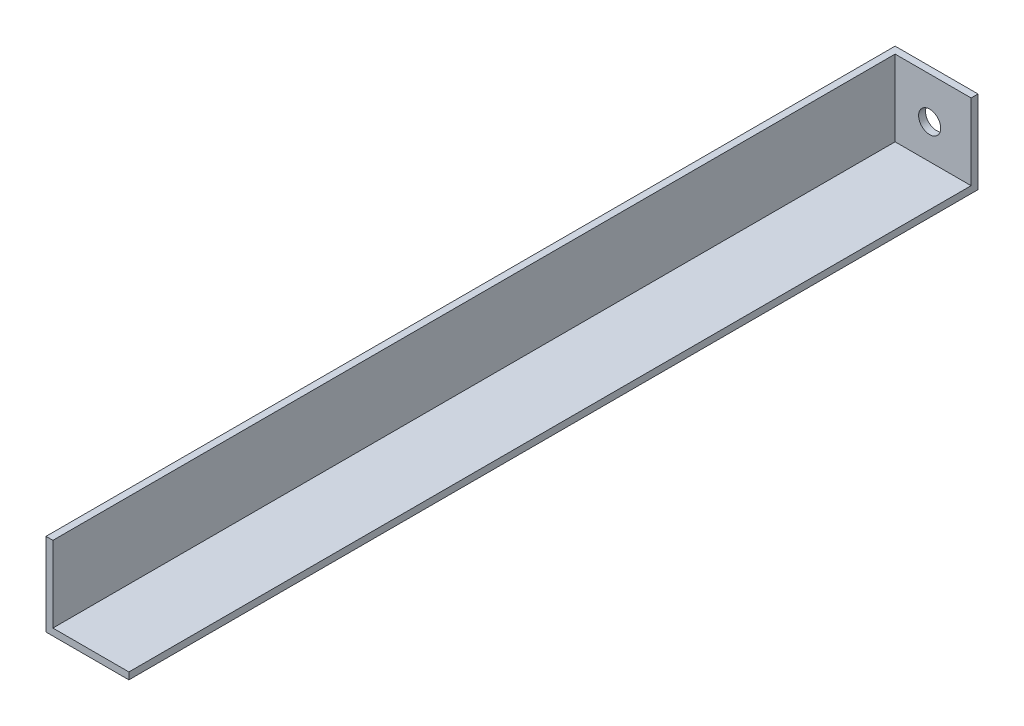
ISO-10303-21;
HEADER;
FILE_DESCRIPTION(('STEP AP214'),'2;1');
FILE_NAME('part.step','',(''),(''),'','','');
FILE_SCHEMA(('AUTOMOTIVE_DESIGN { 1 0 10303 214 1 1 1 1 }'));
ENDSEC;
DATA;
#1=APPLICATION_CONTEXT('core data for automotive mechanical design processes');
#2=APPLICATION_PROTOCOL_DEFINITION('international standard','automotive_design',2000,#1);
#3=PRODUCT_CONTEXT('',#1,'mechanical');
#4=PRODUCT('Part','Part','',(#3));
#5=PRODUCT_RELATED_PRODUCT_CATEGORY('part','',(#4));
#6=PRODUCT_DEFINITION_FORMATION('','',#4);
#7=PRODUCT_DEFINITION_CONTEXT('part definition',#1,'design');
#8=PRODUCT_DEFINITION('design','',#6,#7);
#9=PRODUCT_DEFINITION_SHAPE('','',#8);
#10=(LENGTH_UNIT() NAMED_UNIT(*) SI_UNIT(.MILLI.,.METRE.));
#11=(NAMED_UNIT(*) PLANE_ANGLE_UNIT() SI_UNIT($,.RADIAN.));
#12=(NAMED_UNIT(*) SI_UNIT($,.STERADIAN.) SOLID_ANGLE_UNIT());
#13=UNCERTAINTY_MEASURE_WITH_UNIT(LENGTH_MEASURE(1.E-05),#10,'distance_accuracy_value','');
#14=(GEOMETRIC_REPRESENTATION_CONTEXT(3) GLOBAL_UNCERTAINTY_ASSIGNED_CONTEXT((#13)) GLOBAL_UNIT_ASSIGNED_CONTEXT((#10,
#11,#12)) REPRESENTATION_CONTEXT('',''));
#15=CARTESIAN_POINT('',(0.,0.,0.));
#16=DIRECTION('',(0.,0.,1.));
#17=DIRECTION('',(1.,0.,0.));
#18=AXIS2_PLACEMENT_3D('',#15,#16,#17);
#19=CARTESIAN_POINT('',(30.,0.,304.8));
#20=DIRECTION('',(0.,1.,0.));
#21=DIRECTION('',(-1.,0.,0.));
#22=AXIS2_PLACEMENT_3D('',#19,#20,#21);
#23=PLANE('',#22);
#24=DIRECTION('',(0.,0.,-1.));
#25=VECTOR('',#24,1.);
#26=CARTESIAN_POINT('',(0.,0.,304.8));
#27=LINE('',#26,#25);
#28=CARTESIAN_POINT('',(0.,0.,304.8));
#29=VERTEX_POINT('',#28);
#30=CARTESIAN_POINT('',(0.,0.,-2.5));
#31=VERTEX_POINT('',#30);
#32=EDGE_CURVE('E95',#29,#31,#27,.T.);
#33=ORIENTED_EDGE('',*,*,#32,.T.);
#34=DIRECTION('',(-1.,0.,0.));
#35=VECTOR('',#34,1.);
#36=CARTESIAN_POINT('',(0.,0.,-2.5));
#37=LINE('',#36,#35);
#38=CARTESIAN_POINT('',(30.,0.,-2.5));
#39=VERTEX_POINT('',#38);
#40=EDGE_CURVE('E111',#39,#31,#37,.T.);
#41=ORIENTED_EDGE('',*,*,#40,.F.);
#42=DIRECTION('',(0.,0.,-1.));
#43=VECTOR('',#42,1.);
#44=CARTESIAN_POINT('',(30.,0.,304.8));
#45=LINE('',#44,#43);
#46=CARTESIAN_POINT('',(30.,0.,304.8));
#47=VERTEX_POINT('',#46);
#48=EDGE_CURVE('E11',#47,#39,#45,.T.);
#49=ORIENTED_EDGE('',*,*,#48,.F.);
#50=DIRECTION('',(1.,0.,0.));
#51=VECTOR('',#50,1.);
#52=CARTESIAN_POINT('',(30.,0.,304.8));
#53=LINE('',#52,#51);
#54=EDGE_CURVE('E128',#29,#47,#53,.T.);
#55=ORIENTED_EDGE('',*,*,#54,.F.);
#56=EDGE_LOOP('',(#33,#41,#49,#55));
#57=FACE_BOUND('',#56,.T.);
#58=ADVANCED_FACE('F32',(#57),#23,.F.);
#59=CARTESIAN_POINT('',(30.,2.5,304.8));
#60=DIRECTION('',(-1.,0.,0.));
#61=DIRECTION('',(0.,0.,1.));
#62=AXIS2_PLACEMENT_3D('',#59,#60,#61);
#63=PLANE('',#62);
#64=ORIENTED_EDGE('',*,*,#48,.T.);
#65=DIRECTION('',(0.,-1.,0.));
#66=VECTOR('',#65,1.);
#67=CARTESIAN_POINT('',(30.,0.,-2.5));
#68=LINE('',#67,#66);
#69=CARTESIAN_POINT('',(30.,30.,-2.5));
#70=VERTEX_POINT('',#69);
#71=EDGE_CURVE('E106',#70,#39,#68,.T.);
#72=ORIENTED_EDGE('',*,*,#71,.F.);
#73=DIRECTION('',(0.,0.,1.));
#74=VECTOR('',#73,1.);
#75=CARTESIAN_POINT('',(30.,30.,-2.5));
#76=LINE('',#75,#74);
#77=CARTESIAN_POINT('',(30.,30.,0.));
#78=VERTEX_POINT('',#77);
#79=EDGE_CURVE('E102',#70,#78,#76,.T.);
#80=ORIENTED_EDGE('',*,*,#79,.T.);
#81=DIRECTION('',(0.,-1.,0.));
#82=VECTOR('',#81,1.);
#83=CARTESIAN_POINT('',(30.,0.,0.));
#84=LINE('',#83,#82);
#85=CARTESIAN_POINT('',(30.,2.5,0.));
#86=VERTEX_POINT('',#85);
#87=EDGE_CURVE('E112',#78,#86,#84,.T.);
#88=ORIENTED_EDGE('',*,*,#87,.T.);
#89=DIRECTION('',(0.,0.,-1.));
#90=VECTOR('',#89,1.);
#91=CARTESIAN_POINT('',(30.,2.5,304.8));
#92=LINE('',#91,#90);
#93=CARTESIAN_POINT('',(30.,2.5,304.8));
#94=VERTEX_POINT('',#93);
#95=EDGE_CURVE('E41',#94,#86,#92,.T.);
#96=ORIENTED_EDGE('',*,*,#95,.F.);
#97=DIRECTION('',(0.,1.,0.));
#98=VECTOR('',#97,1.);
#99=CARTESIAN_POINT('',(30.,2.5,304.8));
#100=LINE('',#99,#98);
#101=EDGE_CURVE('E130',#47,#94,#100,.T.);
#102=ORIENTED_EDGE('',*,*,#101,.F.);
#103=EDGE_LOOP('',(#64,#72,#80,#88,#96,#102));
#104=FACE_BOUND('',#103,.T.);
#105=ADVANCED_FACE('F165',(#104),#63,.F.);
#106=CARTESIAN_POINT('',(2.5,2.5,304.8));
#107=DIRECTION('',(0.,-1.,0.));
#108=DIRECTION('',(1.,0.,0.));
#109=AXIS2_PLACEMENT_3D('',#106,#107,#108);
#110=PLANE('',#109);
#111=DIRECTION('',(-1.,0.,0.));
#112=VECTOR('',#111,1.);
#113=CARTESIAN_POINT('',(2.5,2.5,0.));
#114=LINE('',#113,#112);
#115=CARTESIAN_POINT('',(2.5,2.5,0.));
#116=VERTEX_POINT('',#115);
#117=EDGE_CURVE('E146',#86,#116,#114,.T.);
#118=ORIENTED_EDGE('',*,*,#117,.T.);
#119=DIRECTION('',(0.,0.,-1.));
#120=VECTOR('',#119,1.);
#121=CARTESIAN_POINT('',(2.5,2.5,304.8));
#122=LINE('',#121,#120);
#123=CARTESIAN_POINT('',(2.5,2.5,304.8));
#124=VERTEX_POINT('',#123);
#125=EDGE_CURVE('E149',#124,#116,#122,.T.);
#126=ORIENTED_EDGE('',*,*,#125,.F.);
#127=DIRECTION('',(-1.,0.,0.));
#128=VECTOR('',#127,1.);
#129=CARTESIAN_POINT('',(2.5,2.5,304.8));
#130=LINE('',#129,#128);
#131=EDGE_CURVE('E133',#94,#124,#130,.T.);
#132=ORIENTED_EDGE('',*,*,#131,.F.);
#133=ORIENTED_EDGE('',*,*,#95,.T.);
#134=EDGE_LOOP('',(#118,#126,#132,#133));
#135=FACE_BOUND('',#134,.T.);
#136=ADVANCED_FACE('F173',(#135),#110,.F.);
#137=CARTESIAN_POINT('',(2.5,30.,304.8));
#138=DIRECTION('',(-1.,0.,0.));
#139=DIRECTION('',(0.,-1.,0.));
#140=AXIS2_PLACEMENT_3D('',#137,#138,#139);
#141=PLANE('',#140);
#142=DIRECTION('',(0.,1.,0.));
#143=VECTOR('',#142,1.);
#144=CARTESIAN_POINT('',(2.5,30.,0.));
#145=LINE('',#144,#143);
#146=CARTESIAN_POINT('',(2.5,30.,0.));
#147=VERTEX_POINT('',#146);
#148=EDGE_CURVE('E131',#116,#147,#145,.T.);
#149=ORIENTED_EDGE('',*,*,#148,.T.);
#150=DIRECTION('',(0.,0.,-1.));
#151=VECTOR('',#150,1.);
#152=CARTESIAN_POINT('',(2.5,30.,304.8));
#153=LINE('',#152,#151);
#154=CARTESIAN_POINT('',(2.5,30.,304.8));
#155=VERTEX_POINT('',#154);
#156=EDGE_CURVE('E94',#155,#147,#153,.T.);
#157=ORIENTED_EDGE('',*,*,#156,.F.);
#158=DIRECTION('',(0.,1.,0.));
#159=VECTOR('',#158,1.);
#160=CARTESIAN_POINT('',(2.5,30.,304.8));
#161=LINE('',#160,#159);
#162=EDGE_CURVE('E135',#124,#155,#161,.T.);
#163=ORIENTED_EDGE('',*,*,#162,.F.);
#164=ORIENTED_EDGE('',*,*,#125,.T.);
#165=EDGE_LOOP('',(#149,#157,#163,#164));
#166=FACE_BOUND('',#165,.T.);
#167=ADVANCED_FACE('F170',(#166),#141,.F.);
#168=CARTESIAN_POINT('',(0.,30.,304.8));
#169=DIRECTION('',(0.,-1.,0.));
#170=DIRECTION('',(0.,0.,-1.));
#171=AXIS2_PLACEMENT_3D('',#168,#169,#170);
#172=PLANE('',#171);
#173=ORIENTED_EDGE('',*,*,#156,.T.);
#174=DIRECTION('',(1.,0.,0.));
#175=VECTOR('',#174,1.);
#176=CARTESIAN_POINT('',(0.,30.,0.));
#177=LINE('',#176,#175);
#178=EDGE_CURVE('E115',#147,#78,#177,.T.);
#179=ORIENTED_EDGE('',*,*,#178,.T.);
#180=ORIENTED_EDGE('',*,*,#79,.F.);
#181=DIRECTION('',(1.,0.,0.));
#182=VECTOR('',#181,1.);
#183=CARTESIAN_POINT('',(0.,30.,-2.5));
#184=LINE('',#183,#182);
#185=CARTESIAN_POINT('',(0.,30.,-2.5));
#186=VERTEX_POINT('',#185);
#187=EDGE_CURVE('E98',#186,#70,#184,.T.);
#188=ORIENTED_EDGE('',*,*,#187,.F.);
#189=DIRECTION('',(0.,0.,-1.));
#190=VECTOR('',#189,1.);
#191=CARTESIAN_POINT('',(0.,30.,304.8));
#192=LINE('',#191,#190);
#193=CARTESIAN_POINT('',(0.,30.,304.8));
#194=VERTEX_POINT('',#193);
#195=EDGE_CURVE('E87',#194,#186,#192,.T.);
#196=ORIENTED_EDGE('',*,*,#195,.F.);
#197=DIRECTION('',(-1.,0.,0.));
#198=VECTOR('',#197,1.);
#199=CARTESIAN_POINT('',(0.,30.,304.8));
#200=LINE('',#199,#198);
#201=EDGE_CURVE('E137',#155,#194,#200,.T.);
#202=ORIENTED_EDGE('',*,*,#201,.F.);
#203=EDGE_LOOP('',(#173,#179,#180,#188,#196,#202));
#204=FACE_BOUND('',#203,.T.);
#205=ADVANCED_FACE('F100',(#204),#172,.F.);
#206=CARTESIAN_POINT('',(0.,0.,304.8));
#207=DIRECTION('',(1.,0.,0.));
#208=DIRECTION('',(0.,0.,-1.));
#209=AXIS2_PLACEMENT_3D('',#206,#207,#208);
#210=PLANE('',#209);
#211=ORIENTED_EDGE('',*,*,#195,.T.);
#212=DIRECTION('',(0.,1.,0.));
#213=VECTOR('',#212,1.);
#214=CARTESIAN_POINT('',(0.,0.,-2.5));
#215=LINE('',#214,#213);
#216=EDGE_CURVE('E91',#31,#186,#215,.T.);
#217=ORIENTED_EDGE('',*,*,#216,.F.);
#218=ORIENTED_EDGE('',*,*,#32,.F.);
#219=DIRECTION('',(0.,-1.,0.));
#220=VECTOR('',#219,1.);
#221=CARTESIAN_POINT('',(0.,0.,304.8));
#222=LINE('',#221,#220);
#223=EDGE_CURVE('E49',#194,#29,#222,.T.);
#224=ORIENTED_EDGE('',*,*,#223,.F.);
#225=EDGE_LOOP('',(#211,#217,#218,#224));
#226=FACE_BOUND('',#225,.T.);
#227=ADVANCED_FACE('F89',(#226),#210,.F.);
#228=CARTESIAN_POINT('',(0.,0.,304.8));
#229=DIRECTION('',(0.,0.,-1.));
#230=DIRECTION('',(-1.,0.,0.));
#231=AXIS2_PLACEMENT_3D('',#228,#229,#230);
#232=PLANE('',#231);
#233=ORIENTED_EDGE('',*,*,#54,.T.);
#234=ORIENTED_EDGE('',*,*,#101,.T.);
#235=ORIENTED_EDGE('',*,*,#131,.T.);
#236=ORIENTED_EDGE('',*,*,#162,.T.);
#237=ORIENTED_EDGE('',*,*,#201,.T.);
#238=ORIENTED_EDGE('',*,*,#223,.T.);
#239=EDGE_LOOP('',(#233,#234,#235,#236,#237,#238));
#240=FACE_BOUND('',#239,.T.);
#241=ADVANCED_FACE('F171',(#240),#232,.F.);
#242=CARTESIAN_POINT('',(0.,0.,-2.5));
#243=DIRECTION('',(0.,0.,-1.));
#244=DIRECTION('',(-1.,0.,0.));
#245=AXIS2_PLACEMENT_3D('',#242,#243,#244);
#246=PLANE('',#245);
#247=CARTESIAN_POINT('',(15.,15.,-2.5));
#248=DIRECTION('',(0.,0.,-1.));
#249=DIRECTION('',(-1.,0.,0.));
#250=AXIS2_PLACEMENT_3D('',#247,#248,#249);
#251=CIRCLE('',#250,4.);
#252=CARTESIAN_POINT('',(11.,15.,-2.5));
#253=VERTEX_POINT('',#252);
#254=EDGE_CURVE('E118',#253,#253,#251,.T.);
#255=ORIENTED_EDGE('',*,*,#254,.F.);
#256=EDGE_LOOP('',(#255));
#257=FACE_BOUND('',#256,.T.);
#258=ORIENTED_EDGE('',*,*,#216,.T.);
#259=ORIENTED_EDGE('',*,*,#187,.T.);
#260=ORIENTED_EDGE('',*,*,#71,.T.);
#261=ORIENTED_EDGE('',*,*,#40,.T.);
#262=EDGE_LOOP('',(#258,#259,#260,#261));
#263=FACE_BOUND('',#262,.T.);
#264=ADVANCED_FACE('F109',(#257,#263),#246,.T.);
#265=CARTESIAN_POINT('',(0.,0.,0.));
#266=DIRECTION('',(0.,0.,-1.));
#267=DIRECTION('',(-1.,0.,0.));
#268=AXIS2_PLACEMENT_3D('',#265,#266,#267);
#269=PLANE('',#268);
#270=CARTESIAN_POINT('',(15.,15.,0.));
#271=DIRECTION('',(0.,0.,-1.));
#272=DIRECTION('',(-1.,0.,0.));
#273=AXIS2_PLACEMENT_3D('',#270,#271,#272);
#274=CIRCLE('',#273,4.);
#275=CARTESIAN_POINT('',(11.,15.,0.));
#276=VERTEX_POINT('',#275);
#277=EDGE_CURVE('E35',#276,#276,#274,.T.);
#278=ORIENTED_EDGE('',*,*,#277,.T.);
#279=EDGE_LOOP('',(#278));
#280=FACE_BOUND('',#279,.T.);
#281=ORIENTED_EDGE('',*,*,#148,.F.);
#282=ORIENTED_EDGE('',*,*,#117,.F.);
#283=ORIENTED_EDGE('',*,*,#87,.F.);
#284=ORIENTED_EDGE('',*,*,#178,.F.);
#285=EDGE_LOOP('',(#281,#282,#283,#284));
#286=FACE_BOUND('',#285,.T.);
#287=ADVANCED_FACE('F169',(#280,#286),#269,.F.);
#288=CARTESIAN_POINT('',(15.,15.,304.800025));
#289=DIRECTION('',(0.,0.,-1.));
#290=DIRECTION('',(-1.,0.,0.));
#291=AXIS2_PLACEMENT_3D('',#288,#289,#290);
#292=CYLINDRICAL_SURFACE('',#291,4.);
#293=ORIENTED_EDGE('',*,*,#254,.T.);
#294=EDGE_LOOP('',(#293));
#295=FACE_BOUND('',#294,.T.);
#296=ORIENTED_EDGE('',*,*,#277,.F.);
#297=EDGE_LOOP('',(#296));
#298=FACE_BOUND('',#297,.T.);
#299=ADVANCED_FACE('F240',(#295,#298),#292,.F.);
#300=CLOSED_SHELL('',(#58,#105,#136,#167,#205,#227,#241,#264,#287,#299));
#301=MANIFOLD_SOLID_BREP('B2',#300);
#302=ADVANCED_BREP_SHAPE_REPRESENTATION('',(#18,#301),#14);
#303=SHAPE_DEFINITION_REPRESENTATION(#9,#302);
ENDSEC;
END-ISO-10303-21;
